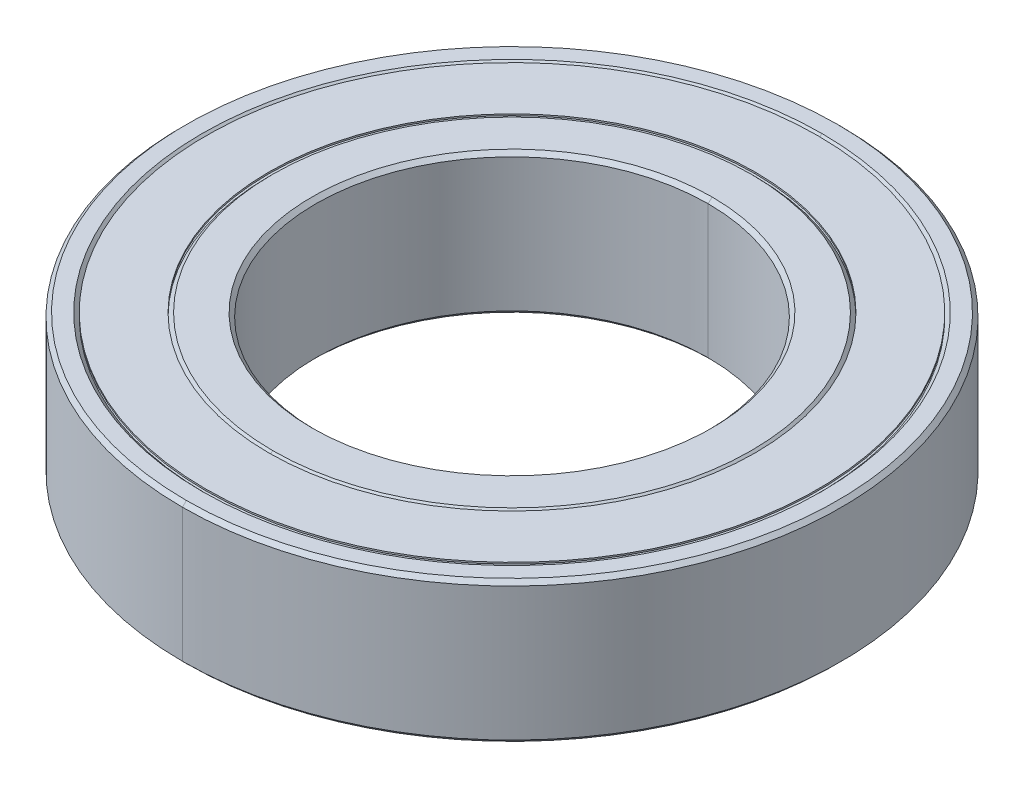
ISO-10303-21;
HEADER;
FILE_DESCRIPTION(('STEP AP214'),'2;1');
FILE_NAME('part.step','',(''),(''),'','','');
FILE_SCHEMA(('AUTOMOTIVE_DESIGN { 1 0 10303 214 1 1 1 1 }'));
ENDSEC;
DATA;
#1=APPLICATION_CONTEXT('core data for automotive mechanical design processes');
#2=APPLICATION_PROTOCOL_DEFINITION('international standard','automotive_design',2000,#1);
#3=PRODUCT_CONTEXT('',#1,'mechanical');
#4=PRODUCT('Part','Part','',(#3));
#5=PRODUCT_RELATED_PRODUCT_CATEGORY('part','',(#4));
#6=PRODUCT_DEFINITION_FORMATION('','',#4);
#7=PRODUCT_DEFINITION_CONTEXT('part definition',#1,'design');
#8=PRODUCT_DEFINITION('design','',#6,#7);
#9=PRODUCT_DEFINITION_SHAPE('','',#8);
#10=(LENGTH_UNIT() NAMED_UNIT(*) SI_UNIT(.MILLI.,.METRE.));
#11=(NAMED_UNIT(*) PLANE_ANGLE_UNIT() SI_UNIT($,.RADIAN.));
#12=(NAMED_UNIT(*) SI_UNIT($,.STERADIAN.) SOLID_ANGLE_UNIT());
#13=UNCERTAINTY_MEASURE_WITH_UNIT(LENGTH_MEASURE(1.E-05),#10,'distance_accuracy_value','');
#14=(GEOMETRIC_REPRESENTATION_CONTEXT(3) GLOBAL_UNCERTAINTY_ASSIGNED_CONTEXT((#13)) GLOBAL_UNIT_ASSIGNED_CONTEXT((#10,
#11,#12)) REPRESENTATION_CONTEXT('',''));
#15=CARTESIAN_POINT('',(0.,0.,0.));
#16=DIRECTION('',(0.,0.,1.));
#17=DIRECTION('',(1.,0.,0.));
#18=AXIS2_PLACEMENT_3D('',#15,#16,#17);
#19=CARTESIAN_POINT('',(0.,4.25,0.));
#20=DIRECTION('',(0.,1.,0.));
#21=DIRECTION('',(0.,0.,1.));
#22=AXIS2_PLACEMENT_3D('',#19,#20,#21);
#23=CONICAL_SURFACE('',#22,19.5,0.785398163397455);
#24=DIRECTION('',(0.,0.707106781186543,-0.707106781186553));
#25=VECTOR('',#24,1.);
#26=CARTESIAN_POINT('',(0.,4.25,-19.5));
#27=LINE('',#26,#25);
#28=CARTESIAN_POINT('',(0.,4.25,-19.5));
#29=VERTEX_POINT('',#28);
#30=CARTESIAN_POINT('',(0.,4.5,-19.75));
#31=VERTEX_POINT('',#30);
#32=EDGE_CURVE('P0_E179',#29,#31,#27,.T.);
#33=ORIENTED_EDGE('',*,*,#32,.F.);
#34=CARTESIAN_POINT('',(0.,4.25,0.));
#35=DIRECTION('',(0.,1.,0.));
#36=DIRECTION('',(0.,0.,1.));
#37=AXIS2_PLACEMENT_3D('',#34,#35,#36);
#38=CIRCLE('',#37,19.5);
#39=CARTESIAN_POINT('',(0.,4.25,19.5));
#40=VERTEX_POINT('',#39);
#41=EDGE_CURVE('P0_E166',#40,#29,#38,.T.);
#42=ORIENTED_EDGE('',*,*,#41,.F.);
#43=DIRECTION('',(0.,0.707106781186543,0.707106781186553));
#44=VECTOR('',#43,1.);
#45=CARTESIAN_POINT('',(0.,4.25,19.5));
#46=LINE('',#45,#44);
#47=CARTESIAN_POINT('',(0.,4.5,19.75));
#48=VERTEX_POINT('',#47);
#49=EDGE_CURVE('P0_E188',#40,#48,#46,.T.);
#50=ORIENTED_EDGE('',*,*,#49,.T.);
#51=CARTESIAN_POINT('',(0.,4.5,0.));
#52=DIRECTION('',(0.,-1.,0.));
#53=DIRECTION('',(0.,0.,1.));
#54=AXIS2_PLACEMENT_3D('',#51,#52,#53);
#55=CIRCLE('',#54,19.75);
#56=EDGE_CURVE('P0_E180',#31,#48,#55,.T.);
#57=ORIENTED_EDGE('',*,*,#56,.F.);
#58=EDGE_LOOP('',(#33,#42,#50,#57));
#59=FACE_BOUND('',#58,.T.);
#60=ADVANCED_FACE('P0_F17',(#59),#23,.F.);
#61=CARTESIAN_POINT('',(0.,4.5,0.));
#62=DIRECTION('',(0.,-1.,0.));
#63=DIRECTION('',(0.,0.,-1.));
#64=AXIS2_PLACEMENT_3D('',#61,#62,#63);
#65=CONICAL_SURFACE('',#64,20.75,0.785398163397462);
#66=DIRECTION('',(0.,-0.707106781186538,0.707106781186558));
#67=VECTOR('',#66,1.);
#68=CARTESIAN_POINT('',(0.,4.5,20.75));
#69=LINE('',#68,#67);
#70=CARTESIAN_POINT('',(0.,4.5,20.75));
#71=VERTEX_POINT('',#70);
#72=CARTESIAN_POINT('',(0.,4.25,21.));
#73=VERTEX_POINT('',#72);
#74=EDGE_CURVE('P0_E234',#71,#73,#69,.T.);
#75=ORIENTED_EDGE('',*,*,#74,.F.);
#76=CARTESIAN_POINT('',(0.,4.5,0.));
#77=DIRECTION('',(0.,1.,0.));
#78=DIRECTION('',(0.,0.,1.));
#79=AXIS2_PLACEMENT_3D('',#76,#77,#78);
#80=CIRCLE('',#79,20.75);
#81=CARTESIAN_POINT('',(0.,4.5,-20.75));
#82=VERTEX_POINT('',#81);
#83=EDGE_CURVE('P0_E289',#82,#71,#80,.T.);
#84=ORIENTED_EDGE('',*,*,#83,.F.);
#85=DIRECTION('',(0.,-0.707106781186538,-0.707106781186558));
#86=VECTOR('',#85,1.);
#87=CARTESIAN_POINT('',(0.,4.5,-20.75));
#88=LINE('',#87,#86);
#89=CARTESIAN_POINT('',(0.,4.25,-21.));
#90=VERTEX_POINT('',#89);
#91=EDGE_CURVE('P0_E205',#82,#90,#88,.T.);
#92=ORIENTED_EDGE('',*,*,#91,.T.);
#93=CARTESIAN_POINT('',(0.,4.25,0.));
#94=DIRECTION('',(0.,-1.,0.));
#95=DIRECTION('',(0.,0.,1.));
#96=AXIS2_PLACEMENT_3D('',#93,#94,#95);
#97=CIRCLE('',#96,21.);
#98=EDGE_CURVE('P0_E210',#73,#90,#97,.T.);
#99=ORIENTED_EDGE('',*,*,#98,.F.);
#100=EDGE_LOOP('',(#75,#84,#92,#99));
#101=FACE_BOUND('',#100,.T.);
#102=ADVANCED_FACE('P0_F388',(#101),#65,.T.);
#103=CARTESIAN_POINT('',(0.,4.25,0.));
#104=DIRECTION('',(0.,1.,0.));
#105=DIRECTION('',(0.,0.,1.));
#106=AXIS2_PLACEMENT_3D('',#103,#104,#105);
#107=CONICAL_SURFACE('',#106,12.5,0.785398163397459);
#108=DIRECTION('',(0.,0.70710678118654,-0.707106781186555));
#109=VECTOR('',#108,1.);
#110=CARTESIAN_POINT('',(0.,4.25,-12.5));
#111=LINE('',#110,#109);
#112=CARTESIAN_POINT('',(0.,4.25,-12.5));
#113=VERTEX_POINT('',#112);
#114=CARTESIAN_POINT('',(0.,4.5,-12.75));
#115=VERTEX_POINT('',#114);
#116=EDGE_CURVE('P0_E204',#113,#115,#111,.T.);
#117=ORIENTED_EDGE('',*,*,#116,.F.);
#118=CARTESIAN_POINT('',(0.,4.25,0.));
#119=DIRECTION('',(0.,1.,0.));
#120=DIRECTION('',(0.,0.,1.));
#121=AXIS2_PLACEMENT_3D('',#118,#119,#120);
#122=CIRCLE('',#121,12.5);
#123=CARTESIAN_POINT('',(0.,4.25,12.5));
#124=VERTEX_POINT('',#123);
#125=EDGE_CURVE('P0_E209',#124,#113,#122,.T.);
#126=ORIENTED_EDGE('',*,*,#125,.F.);
#127=DIRECTION('',(0.,0.70710678118654,0.707106781186555));
#128=VECTOR('',#127,1.);
#129=CARTESIAN_POINT('',(0.,4.25,12.5));
#130=LINE('',#129,#128);
#131=CARTESIAN_POINT('',(0.,4.5,12.75));
#132=VERTEX_POINT('',#131);
#133=EDGE_CURVE('P0_E213',#124,#132,#130,.T.);
#134=ORIENTED_EDGE('',*,*,#133,.T.);
#135=CARTESIAN_POINT('',(0.,4.5,0.));
#136=DIRECTION('',(0.,-1.,0.));
#137=DIRECTION('',(0.,0.,1.));
#138=AXIS2_PLACEMENT_3D('',#135,#136,#137);
#139=CIRCLE('',#138,12.75);
#140=EDGE_CURVE('P0_E346',#115,#132,#139,.T.);
#141=ORIENTED_EDGE('',*,*,#140,.F.);
#142=EDGE_LOOP('',(#117,#126,#134,#141));
#143=FACE_BOUND('',#142,.T.);
#144=ADVANCED_FACE('P0_F392',(#143),#107,.F.);
#145=CARTESIAN_POINT('',(0.,4.5,0.));
#146=DIRECTION('',(0.,-1.,0.));
#147=DIRECTION('',(0.,0.,-1.));
#148=AXIS2_PLACEMENT_3D('',#145,#146,#147);
#149=CONICAL_SURFACE('',#148,15.25,0.785398163397448);
#150=DIRECTION('',(0.,-0.707106781186548,0.707106781186548));
#151=VECTOR('',#150,1.);
#152=CARTESIAN_POINT('',(0.,4.5,15.25));
#153=LINE('',#152,#151);
#154=CARTESIAN_POINT('',(0.,4.5,15.25));
#155=VERTEX_POINT('',#154);
#156=CARTESIAN_POINT('',(0.,4.25,15.5));
#157=VERTEX_POINT('',#156);
#158=EDGE_CURVE('P0_E198',#155,#157,#153,.T.);
#159=ORIENTED_EDGE('',*,*,#158,.F.);
#160=CARTESIAN_POINT('',(0.,4.5,0.));
#161=DIRECTION('',(0.,1.,0.));
#162=DIRECTION('',(0.,0.,1.));
#163=AXIS2_PLACEMENT_3D('',#160,#161,#162);
#164=CIRCLE('',#163,15.25);
#165=CARTESIAN_POINT('',(0.,4.5,-15.25));
#166=VERTEX_POINT('',#165);
#167=EDGE_CURVE('P0_E343',#166,#155,#164,.T.);
#168=ORIENTED_EDGE('',*,*,#167,.F.);
#169=DIRECTION('',(0.,-0.707106781186548,-0.707106781186548));
#170=VECTOR('',#169,1.);
#171=CARTESIAN_POINT('',(0.,4.5,-15.25));
#172=LINE('',#171,#170);
#173=CARTESIAN_POINT('',(0.,4.25,-15.5));
#174=VERTEX_POINT('',#173);
#175=EDGE_CURVE('P0_E197',#166,#174,#172,.T.);
#176=ORIENTED_EDGE('',*,*,#175,.T.);
#177=CARTESIAN_POINT('',(0.,4.25,0.));
#178=DIRECTION('',(0.,1.,0.));
#179=DIRECTION('',(0.,0.,1.));
#180=AXIS2_PLACEMENT_3D('',#177,#178,#179);
#181=CIRCLE('',#180,15.5);
#182=EDGE_CURVE('P0_E175',#174,#157,#181,.T.);
#183=ORIENTED_EDGE('',*,*,#182,.T.);
#184=EDGE_LOOP('',(#159,#168,#176,#183));
#185=FACE_BOUND('',#184,.T.);
#186=ADVANCED_FACE('P0_F397',(#185),#149,.T.);
#187=CARTESIAN_POINT('',(0.,-4.5,0.));
#188=DIRECTION('',(0.,-1.,0.));
#189=DIRECTION('',(0.,0.,-1.));
#190=AXIS2_PLACEMENT_3D('',#187,#188,#189);
#191=CONICAL_SURFACE('',#190,19.75,0.785398163397462);
#192=DIRECTION('',(0.,-0.707106781186538,0.707106781186558));
#193=VECTOR('',#192,1.);
#194=CARTESIAN_POINT('',(0.,-4.5,19.75));
#195=LINE('',#194,#193);
#196=CARTESIAN_POINT('',(0.,-4.25,19.5));
#197=VERTEX_POINT('',#196);
#198=CARTESIAN_POINT('',(0.,-4.5,19.75));
#199=VERTEX_POINT('',#198);
#200=EDGE_CURVE('P0_E269',#197,#199,#195,.T.);
#201=ORIENTED_EDGE('',*,*,#200,.F.);
#202=CARTESIAN_POINT('',(0.,-4.25,0.));
#203=DIRECTION('',(0.,1.,0.));
#204=DIRECTION('',(0.,0.,1.));
#205=AXIS2_PLACEMENT_3D('',#202,#203,#204);
#206=CIRCLE('',#205,19.5);
#207=CARTESIAN_POINT('',(0.,-4.25,-19.5));
#208=VERTEX_POINT('',#207);
#209=EDGE_CURVE('P0_E25',#197,#208,#206,.T.);
#210=ORIENTED_EDGE('',*,*,#209,.T.);
#211=DIRECTION('',(0.,-0.707106781186538,-0.707106781186558));
#212=VECTOR('',#211,1.);
#213=CARTESIAN_POINT('',(0.,-4.5,-19.75));
#214=LINE('',#213,#212);
#215=CARTESIAN_POINT('',(0.,-4.5,-19.75));
#216=VERTEX_POINT('',#215);
#217=EDGE_CURVE('P0_E279',#208,#216,#214,.T.);
#218=ORIENTED_EDGE('',*,*,#217,.T.);
#219=CARTESIAN_POINT('',(0.,-4.5,0.));
#220=DIRECTION('',(0.,1.,0.));
#221=DIRECTION('',(0.,0.,1.));
#222=AXIS2_PLACEMENT_3D('',#219,#220,#221);
#223=CIRCLE('',#222,19.75);
#224=EDGE_CURVE('P0_E353',#199,#216,#223,.T.);
#225=ORIENTED_EDGE('',*,*,#224,.F.);
#226=EDGE_LOOP('',(#201,#210,#218,#225));
#227=FACE_BOUND('',#226,.T.);
#228=ADVANCED_FACE('P0_F365',(#227),#191,.F.);
#229=CARTESIAN_POINT('',(0.,-4.25,0.));
#230=DIRECTION('',(0.,1.,0.));
#231=DIRECTION('',(0.,0.,1.));
#232=AXIS2_PLACEMENT_3D('',#229,#230,#231);
#233=CONICAL_SURFACE('',#232,21.,0.785398163397455);
#234=DIRECTION('',(0.,0.707106781186543,-0.707106781186553));
#235=VECTOR('',#234,1.);
#236=CARTESIAN_POINT('',(0.,-4.25,-21.));
#237=LINE('',#236,#235);
#238=CARTESIAN_POINT('',(0.,-4.5,-20.75));
#239=VERTEX_POINT('',#238);
#240=CARTESIAN_POINT('',(0.,-4.25,-21.));
#241=VERTEX_POINT('',#240);
#242=EDGE_CURVE('P0_E225',#239,#241,#237,.T.);
#243=ORIENTED_EDGE('',*,*,#242,.F.);
#244=CARTESIAN_POINT('',(0.,-4.5,0.));
#245=DIRECTION('',(0.,-1.,0.));
#246=DIRECTION('',(0.,0.,1.));
#247=AXIS2_PLACEMENT_3D('',#244,#245,#246);
#248=CIRCLE('',#247,20.75);
#249=CARTESIAN_POINT('',(0.,-4.5,20.75));
#250=VERTEX_POINT('',#249);
#251=EDGE_CURVE('P0_E288',#250,#239,#248,.T.);
#252=ORIENTED_EDGE('',*,*,#251,.F.);
#253=DIRECTION('',(0.,0.707106781186543,0.707106781186553));
#254=VECTOR('',#253,1.);
#255=CARTESIAN_POINT('',(0.,-4.25,21.));
#256=LINE('',#255,#254);
#257=CARTESIAN_POINT('',(0.,-4.25,21.));
#258=VERTEX_POINT('',#257);
#259=EDGE_CURVE('P0_E293',#250,#258,#256,.T.);
#260=ORIENTED_EDGE('',*,*,#259,.T.);
#261=CARTESIAN_POINT('',(0.,-4.25,0.));
#262=DIRECTION('',(0.,1.,0.));
#263=DIRECTION('',(0.,0.,1.));
#264=AXIS2_PLACEMENT_3D('',#261,#262,#263);
#265=CIRCLE('',#264,21.);
#266=EDGE_CURVE('P0_E206',#241,#258,#265,.T.);
#267=ORIENTED_EDGE('',*,*,#266,.F.);
#268=EDGE_LOOP('',(#243,#252,#260,#267));
#269=FACE_BOUND('',#268,.T.);
#270=ADVANCED_FACE('P0_F404',(#269),#233,.T.);
#271=CARTESIAN_POINT('',(0.,-4.5,0.));
#272=DIRECTION('',(0.,-1.,0.));
#273=DIRECTION('',(0.,0.,-1.));
#274=AXIS2_PLACEMENT_3D('',#271,#272,#273);
#275=CONICAL_SURFACE('',#274,12.75,0.785398163397438);
#276=DIRECTION('',(0.,-0.707106781186555,0.70710678118654));
#277=VECTOR('',#276,1.);
#278=CARTESIAN_POINT('',(0.,-4.5,12.75));
#279=LINE('',#278,#277);
#280=CARTESIAN_POINT('',(0.,-4.25,12.5));
#281=VERTEX_POINT('',#280);
#282=CARTESIAN_POINT('',(0.,-4.5,12.75));
#283=VERTEX_POINT('',#282);
#284=EDGE_CURVE('P0_E301',#281,#283,#279,.T.);
#285=ORIENTED_EDGE('',*,*,#284,.F.);
#286=CARTESIAN_POINT('',(0.,-4.25,0.));
#287=DIRECTION('',(0.,-1.,0.));
#288=DIRECTION('',(0.,0.,1.));
#289=AXIS2_PLACEMENT_3D('',#286,#287,#288);
#290=CIRCLE('',#289,12.5);
#291=CARTESIAN_POINT('',(0.,-4.25,-12.5));
#292=VERTEX_POINT('',#291);
#293=EDGE_CURVE('P0_E176',#292,#281,#290,.T.);
#294=ORIENTED_EDGE('',*,*,#293,.F.);
#295=DIRECTION('',(0.,-0.707106781186555,-0.70710678118654));
#296=VECTOR('',#295,1.);
#297=CARTESIAN_POINT('',(0.,-4.5,-12.75));
#298=LINE('',#297,#296);
#299=CARTESIAN_POINT('',(0.,-4.5,-12.75));
#300=VERTEX_POINT('',#299);
#301=EDGE_CURVE('P0_E309',#292,#300,#298,.T.);
#302=ORIENTED_EDGE('',*,*,#301,.T.);
#303=CARTESIAN_POINT('',(0.,-4.5,0.));
#304=DIRECTION('',(0.,1.,0.));
#305=DIRECTION('',(0.,0.,1.));
#306=AXIS2_PLACEMENT_3D('',#303,#304,#305);
#307=CIRCLE('',#306,12.75);
#308=EDGE_CURVE('P0_E340',#283,#300,#307,.T.);
#309=ORIENTED_EDGE('',*,*,#308,.F.);
#310=EDGE_LOOP('',(#285,#294,#302,#309));
#311=FACE_BOUND('',#310,.T.);
#312=ADVANCED_FACE('P0_F383',(#311),#275,.F.);
#313=CARTESIAN_POINT('',(0.,-4.25,0.));
#314=DIRECTION('',(0.,1.,0.));
#315=DIRECTION('',(0.,0.,1.));
#316=AXIS2_PLACEMENT_3D('',#313,#314,#315);
#317=CONICAL_SURFACE('',#316,15.5,0.785398163397452);
#318=DIRECTION('',(0.,0.707106781186545,-0.70710678118655));
#319=VECTOR('',#318,1.);
#320=CARTESIAN_POINT('',(0.,-4.25,-15.5));
#321=LINE('',#320,#319);
#322=CARTESIAN_POINT('',(0.,-4.5,-15.25));
#323=VERTEX_POINT('',#322);
#324=CARTESIAN_POINT('',(0.,-4.25,-15.5));
#325=VERTEX_POINT('',#324);
#326=EDGE_CURVE('P0_E256',#323,#325,#321,.T.);
#327=ORIENTED_EDGE('',*,*,#326,.F.);
#328=CARTESIAN_POINT('',(0.,-4.5,0.));
#329=DIRECTION('',(0.,-1.,0.));
#330=DIRECTION('',(0.,0.,1.));
#331=AXIS2_PLACEMENT_3D('',#328,#329,#330);
#332=CIRCLE('',#331,15.25);
#333=CARTESIAN_POINT('',(0.,-4.5,15.25));
#334=VERTEX_POINT('',#333);
#335=EDGE_CURVE('P0_E337',#334,#323,#332,.T.);
#336=ORIENTED_EDGE('',*,*,#335,.F.);
#337=DIRECTION('',(0.,0.707106781186545,0.70710678118655));
#338=VECTOR('',#337,1.);
#339=CARTESIAN_POINT('',(0.,-4.25,15.5));
#340=LINE('',#339,#338);
#341=CARTESIAN_POINT('',(0.,-4.25,15.5));
#342=VERTEX_POINT('',#341);
#343=EDGE_CURVE('P0_E318',#334,#342,#340,.T.);
#344=ORIENTED_EDGE('',*,*,#343,.T.);
#345=CARTESIAN_POINT('',(0.,-4.25,0.));
#346=DIRECTION('',(0.,1.,0.));
#347=DIRECTION('',(0.,0.,1.));
#348=AXIS2_PLACEMENT_3D('',#345,#346,#347);
#349=CIRCLE('',#348,15.5);
#350=EDGE_CURVE('P0_E11',#325,#342,#349,.T.);
#351=ORIENTED_EDGE('',*,*,#350,.F.);
#352=EDGE_LOOP('',(#327,#336,#344,#351));
#353=FACE_BOUND('',#352,.T.);
#354=ADVANCED_FACE('P0_F373',(#353),#317,.T.);
#355=CARTESIAN_POINT('',(0.,-4.25,0.));
#356=DIRECTION('',(0.,-1.,0.));
#357=DIRECTION('',(0.,0.,-1.));
#358=AXIS2_PLACEMENT_3D('',#355,#356,#357);
#359=PLANE('',#358);
#360=CARTESIAN_POINT('',(0.,-4.25,0.));
#361=DIRECTION('',(0.,1.,0.));
#362=DIRECTION('',(0.,0.,1.));
#363=AXIS2_PLACEMENT_3D('',#360,#361,#362);
#364=CIRCLE('',#363,15.5);
#365=EDGE_CURVE('P0_E260',#342,#325,#364,.T.);
#366=ORIENTED_EDGE('',*,*,#365,.T.);
#367=ORIENTED_EDGE('',*,*,#350,.T.);
#368=EDGE_LOOP('',(#366,#367));
#369=FACE_BOUND('',#368,.T.);
#370=CARTESIAN_POINT('',(0.,-4.25,0.));
#371=DIRECTION('',(0.,1.,0.));
#372=DIRECTION('',(0.,0.,1.));
#373=AXIS2_PLACEMENT_3D('',#370,#371,#372);
#374=CIRCLE('',#373,19.5);
#375=EDGE_CURVE('P0_E265',#208,#197,#374,.T.);
#376=ORIENTED_EDGE('',*,*,#375,.F.);
#377=ORIENTED_EDGE('',*,*,#209,.F.);
#378=EDGE_LOOP('',(#376,#377));
#379=FACE_BOUND('',#378,.T.);
#380=ADVANCED_FACE('P0_F371',(#369,#379),#359,.T.);
#381=CARTESIAN_POINT('',(0.,4.25,0.));
#382=DIRECTION('',(0.,1.,0.));
#383=DIRECTION('',(1.,0.,0.));
#384=AXIS2_PLACEMENT_3D('',#381,#382,#383);
#385=PLANE('',#384);
#386=ORIENTED_EDGE('',*,*,#182,.F.);
#387=CARTESIAN_POINT('',(0.,4.25,0.));
#388=DIRECTION('',(0.,1.,0.));
#389=DIRECTION('',(0.,0.,1.));
#390=AXIS2_PLACEMENT_3D('',#387,#388,#389);
#391=CIRCLE('',#390,15.5);
#392=EDGE_CURVE('P0_E195',#157,#174,#391,.T.);
#393=ORIENTED_EDGE('',*,*,#392,.F.);
#394=EDGE_LOOP('',(#386,#393));
#395=FACE_BOUND('',#394,.T.);
#396=ORIENTED_EDGE('',*,*,#41,.T.);
#397=CARTESIAN_POINT('',(0.,4.25,0.));
#398=DIRECTION('',(0.,1.,0.));
#399=DIRECTION('',(0.,0.,1.));
#400=AXIS2_PLACEMENT_3D('',#397,#398,#399);
#401=CIRCLE('',#400,19.5);
#402=EDGE_CURVE('P0_E170',#29,#40,#401,.T.);
#403=ORIENTED_EDGE('',*,*,#402,.T.);
#404=EDGE_LOOP('',(#396,#403));
#405=FACE_BOUND('',#404,.T.);
#406=ADVANCED_FACE('P0_F168',(#395,#405),#385,.T.);
#407=CARTESIAN_POINT('',(0.,4.5,0.));
#408=DIRECTION('',(0.,-1.,0.));
#409=DIRECTION('',(0.,0.,-1.));
#410=AXIS2_PLACEMENT_3D('',#407,#408,#409);
#411=CYLINDRICAL_SURFACE('',#410,12.5);
#412=DIRECTION('',(0.,-1.,0.));
#413=VECTOR('',#412,1.);
#414=CARTESIAN_POINT('',(0.,4.5,12.5));
#415=LINE('',#414,#413);
#416=EDGE_CURVE('P0_E321',#124,#281,#415,.T.);
#417=ORIENTED_EDGE('',*,*,#416,.F.);
#418=ORIENTED_EDGE('',*,*,#125,.T.);
#419=DIRECTION('',(0.,-1.,0.));
#420=VECTOR('',#419,1.);
#421=CARTESIAN_POINT('',(0.,4.5,-12.5));
#422=LINE('',#421,#420);
#423=EDGE_CURVE('P0_E325',#113,#292,#422,.T.);
#424=ORIENTED_EDGE('',*,*,#423,.T.);
#425=ORIENTED_EDGE('',*,*,#293,.T.);
#426=EDGE_LOOP('',(#417,#418,#424,#425));
#427=FACE_BOUND('',#426,.T.);
#428=ADVANCED_FACE('P0_F380',(#427),#411,.F.);
#429=CARTESIAN_POINT('',(0.,4.5,0.));
#430=DIRECTION('',(0.,-1.,0.));
#431=DIRECTION('',(0.,0.,-1.));
#432=AXIS2_PLACEMENT_3D('',#429,#430,#431);
#433=CYLINDRICAL_SURFACE('',#432,21.);
#434=DIRECTION('',(0.,-1.,0.));
#435=VECTOR('',#434,1.);
#436=CARTESIAN_POINT('',(0.,4.5,21.));
#437=LINE('',#436,#435);
#438=EDGE_CURVE('P0_E329',#73,#258,#437,.T.);
#439=ORIENTED_EDGE('',*,*,#438,.F.);
#440=ORIENTED_EDGE('',*,*,#98,.T.);
#441=DIRECTION('',(0.,-1.,0.));
#442=VECTOR('',#441,1.);
#443=CARTESIAN_POINT('',(0.,4.5,-21.));
#444=LINE('',#443,#442);
#445=EDGE_CURVE('P0_E333',#90,#241,#444,.T.);
#446=ORIENTED_EDGE('',*,*,#445,.T.);
#447=ORIENTED_EDGE('',*,*,#266,.T.);
#448=EDGE_LOOP('',(#439,#440,#446,#447));
#449=FACE_BOUND('',#448,.T.);
#450=ADVANCED_FACE('P0_F413',(#449),#433,.T.);
#451=CARTESIAN_POINT('',(0.,-4.5,0.));
#452=DIRECTION('',(0.,1.,0.));
#453=DIRECTION('',(1.,0.,0.));
#454=AXIS2_PLACEMENT_3D('',#451,#452,#453);
#455=PLANE('',#454);
#456=CARTESIAN_POINT('',(0.,-4.5,0.));
#457=DIRECTION('',(0.,1.,0.));
#458=DIRECTION('',(0.,0.,1.));
#459=AXIS2_PLACEMENT_3D('',#456,#457,#458);
#460=CIRCLE('',#459,19.75);
#461=EDGE_CURVE('P0_E273',#216,#199,#460,.T.);
#462=ORIENTED_EDGE('',*,*,#461,.T.);
#463=ORIENTED_EDGE('',*,*,#224,.T.);
#464=EDGE_LOOP('',(#462,#463));
#465=FACE_BOUND('',#464,.T.);
#466=ORIENTED_EDGE('',*,*,#251,.T.);
#467=CARTESIAN_POINT('',(0.,-4.5,0.));
#468=DIRECTION('',(0.,-1.,0.));
#469=DIRECTION('',(0.,0.,1.));
#470=AXIS2_PLACEMENT_3D('',#467,#468,#469);
#471=CIRCLE('',#470,20.75);
#472=EDGE_CURVE('P0_E230',#239,#250,#471,.T.);
#473=ORIENTED_EDGE('',*,*,#472,.T.);
#474=EDGE_LOOP('',(#466,#473));
#475=FACE_BOUND('',#474,.T.);
#476=ADVANCED_FACE('P0_F417',(#465,#475),#455,.F.);
#477=CARTESIAN_POINT('',(0.,4.5,0.));
#478=DIRECTION('',(0.,1.,0.));
#479=DIRECTION('',(1.,0.,0.));
#480=AXIS2_PLACEMENT_3D('',#477,#478,#479);
#481=PLANE('',#480);
#482=CARTESIAN_POINT('',(0.,4.5,0.));
#483=DIRECTION('',(0.,-1.,0.));
#484=DIRECTION('',(0.,0.,1.));
#485=AXIS2_PLACEMENT_3D('',#482,#483,#484);
#486=CIRCLE('',#485,19.75);
#487=EDGE_CURVE('P0_E185',#48,#31,#486,.T.);
#488=ORIENTED_EDGE('',*,*,#487,.T.);
#489=ORIENTED_EDGE('',*,*,#56,.T.);
#490=EDGE_LOOP('',(#488,#489));
#491=FACE_BOUND('',#490,.T.);
#492=ORIENTED_EDGE('',*,*,#83,.T.);
#493=CARTESIAN_POINT('',(0.,4.5,0.));
#494=DIRECTION('',(0.,1.,0.));
#495=DIRECTION('',(0.,0.,1.));
#496=AXIS2_PLACEMENT_3D('',#493,#494,#495);
#497=CIRCLE('',#496,20.75);
#498=EDGE_CURVE('P0_E221',#71,#82,#497,.T.);
#499=ORIENTED_EDGE('',*,*,#498,.T.);
#500=EDGE_LOOP('',(#492,#499));
#501=FACE_BOUND('',#500,.T.);
#502=ADVANCED_FACE('P0_F419',(#491,#501),#481,.T.);
#503=CARTESIAN_POINT('',(0.,4.5,0.));
#504=DIRECTION('',(0.,1.,0.));
#505=DIRECTION('',(1.,0.,0.));
#506=AXIS2_PLACEMENT_3D('',#503,#504,#505);
#507=PLANE('',#506);
#508=CARTESIAN_POINT('',(0.,4.5,0.));
#509=DIRECTION('',(0.,-1.,0.));
#510=DIRECTION('',(0.,0.,1.));
#511=AXIS2_PLACEMENT_3D('',#508,#509,#510);
#512=CIRCLE('',#511,12.75);
#513=EDGE_CURVE('P0_E218',#132,#115,#512,.T.);
#514=ORIENTED_EDGE('',*,*,#513,.T.);
#515=ORIENTED_EDGE('',*,*,#140,.T.);
#516=EDGE_LOOP('',(#514,#515));
#517=FACE_BOUND('',#516,.T.);
#518=ORIENTED_EDGE('',*,*,#167,.T.);
#519=CARTESIAN_POINT('',(0.,4.5,0.));
#520=DIRECTION('',(0.,1.,0.));
#521=DIRECTION('',(0.,0.,1.));
#522=AXIS2_PLACEMENT_3D('',#519,#520,#521);
#523=CIRCLE('',#522,15.25);
#524=EDGE_CURVE('P0_E217',#155,#166,#523,.T.);
#525=ORIENTED_EDGE('',*,*,#524,.T.);
#526=EDGE_LOOP('',(#518,#525));
#527=FACE_BOUND('',#526,.T.);
#528=ADVANCED_FACE('P0_F422',(#517,#527),#507,.T.);
#529=CARTESIAN_POINT('',(0.,-4.5,0.));
#530=DIRECTION('',(0.,1.,0.));
#531=DIRECTION('',(1.,0.,0.));
#532=AXIS2_PLACEMENT_3D('',#529,#530,#531);
#533=PLANE('',#532);
#534=CARTESIAN_POINT('',(0.,-4.5,0.));
#535=DIRECTION('',(0.,1.,0.));
#536=DIRECTION('',(0.,0.,1.));
#537=AXIS2_PLACEMENT_3D('',#534,#535,#536);
#538=CIRCLE('',#537,12.75);
#539=EDGE_CURVE('P0_E305',#300,#283,#538,.T.);
#540=ORIENTED_EDGE('',*,*,#539,.T.);
#541=ORIENTED_EDGE('',*,*,#308,.T.);
#542=EDGE_LOOP('',(#540,#541));
#543=FACE_BOUND('',#542,.T.);
#544=ORIENTED_EDGE('',*,*,#335,.T.);
#545=CARTESIAN_POINT('',(0.,-4.5,0.));
#546=DIRECTION('',(0.,-1.,0.));
#547=DIRECTION('',(0.,0.,1.));
#548=AXIS2_PLACEMENT_3D('',#545,#546,#547);
#549=CIRCLE('',#548,15.25);
#550=EDGE_CURVE('P0_E261',#323,#334,#549,.T.);
#551=ORIENTED_EDGE('',*,*,#550,.T.);
#552=EDGE_LOOP('',(#544,#551));
#553=FACE_BOUND('',#552,.T.);
#554=ADVANCED_FACE('P0_F426',(#543,#553),#533,.F.);
#555=CARTESIAN_POINT('',(0.,4.5,0.));
#556=DIRECTION('',(0.,-1.,0.));
#557=DIRECTION('',(0.,0.,-1.));
#558=AXIS2_PLACEMENT_3D('',#555,#556,#557);
#559=CYLINDRICAL_SURFACE('',#558,21.);
#560=CARTESIAN_POINT('',(0.,4.25,0.));
#561=DIRECTION('',(0.,-1.,0.));
#562=DIRECTION('',(0.,0.,1.));
#563=AXIS2_PLACEMENT_3D('',#560,#561,#562);
#564=CIRCLE('',#563,21.);
#565=EDGE_CURVE('P0_E238',#90,#73,#564,.T.);
#566=ORIENTED_EDGE('',*,*,#565,.T.);
#567=ORIENTED_EDGE('',*,*,#438,.T.);
#568=CARTESIAN_POINT('',(0.,-4.25,0.));
#569=DIRECTION('',(0.,1.,0.));
#570=DIRECTION('',(0.,0.,1.));
#571=AXIS2_PLACEMENT_3D('',#568,#569,#570);
#572=CIRCLE('',#571,21.);
#573=EDGE_CURVE('P0_E229',#258,#241,#572,.T.);
#574=ORIENTED_EDGE('',*,*,#573,.T.);
#575=ORIENTED_EDGE('',*,*,#445,.F.);
#576=EDGE_LOOP('',(#566,#567,#574,#575));
#577=FACE_BOUND('',#576,.T.);
#578=ADVANCED_FACE('P0_F429',(#577),#559,.T.);
#579=CARTESIAN_POINT('',(0.,4.5,0.));
#580=DIRECTION('',(0.,-1.,0.));
#581=DIRECTION('',(0.,0.,-1.));
#582=AXIS2_PLACEMENT_3D('',#579,#580,#581);
#583=CYLINDRICAL_SURFACE('',#582,12.5);
#584=CARTESIAN_POINT('',(0.,4.25,0.));
#585=DIRECTION('',(0.,1.,0.));
#586=DIRECTION('',(0.,0.,1.));
#587=AXIS2_PLACEMENT_3D('',#584,#585,#586);
#588=CIRCLE('',#587,12.5);
#589=EDGE_CURVE('P0_E200',#113,#124,#588,.T.);
#590=ORIENTED_EDGE('',*,*,#589,.T.);
#591=ORIENTED_EDGE('',*,*,#416,.T.);
#592=CARTESIAN_POINT('',(0.,-4.25,0.));
#593=DIRECTION('',(0.,-1.,0.));
#594=DIRECTION('',(0.,0.,1.));
#595=AXIS2_PLACEMENT_3D('',#592,#593,#594);
#596=CIRCLE('',#595,12.5);
#597=EDGE_CURVE('P0_E297',#281,#292,#596,.T.);
#598=ORIENTED_EDGE('',*,*,#597,.T.);
#599=ORIENTED_EDGE('',*,*,#423,.F.);
#600=EDGE_LOOP('',(#590,#591,#598,#599));
#601=FACE_BOUND('',#600,.T.);
#602=ADVANCED_FACE('P0_F431',(#601),#583,.F.);
#603=CARTESIAN_POINT('',(0.,-4.25,0.));
#604=DIRECTION('',(0.,1.,0.));
#605=DIRECTION('',(0.,0.,1.));
#606=AXIS2_PLACEMENT_3D('',#603,#604,#605);
#607=CONICAL_SURFACE('',#606,15.5,0.785398163397452);
#608=ORIENTED_EDGE('',*,*,#550,.F.);
#609=ORIENTED_EDGE('',*,*,#326,.T.);
#610=ORIENTED_EDGE('',*,*,#365,.F.);
#611=ORIENTED_EDGE('',*,*,#343,.F.);
#612=EDGE_LOOP('',(#608,#609,#610,#611));
#613=FACE_BOUND('',#612,.T.);
#614=ADVANCED_FACE('P0_F433',(#613),#607,.T.);
#615=CARTESIAN_POINT('',(0.,-4.5,0.));
#616=DIRECTION('',(0.,-1.,0.));
#617=DIRECTION('',(0.,0.,-1.));
#618=AXIS2_PLACEMENT_3D('',#615,#616,#617);
#619=CONICAL_SURFACE('',#618,12.75,0.785398163397438);
#620=ORIENTED_EDGE('',*,*,#597,.F.);
#621=ORIENTED_EDGE('',*,*,#284,.T.);
#622=ORIENTED_EDGE('',*,*,#539,.F.);
#623=ORIENTED_EDGE('',*,*,#301,.F.);
#624=EDGE_LOOP('',(#620,#621,#622,#623));
#625=FACE_BOUND('',#624,.T.);
#626=ADVANCED_FACE('P0_F439',(#625),#619,.F.);
#627=CARTESIAN_POINT('',(0.,-4.25,0.));
#628=DIRECTION('',(0.,1.,0.));
#629=DIRECTION('',(0.,0.,1.));
#630=AXIS2_PLACEMENT_3D('',#627,#628,#629);
#631=CONICAL_SURFACE('',#630,21.,0.785398163397455);
#632=ORIENTED_EDGE('',*,*,#472,.F.);
#633=ORIENTED_EDGE('',*,*,#242,.T.);
#634=ORIENTED_EDGE('',*,*,#573,.F.);
#635=ORIENTED_EDGE('',*,*,#259,.F.);
#636=EDGE_LOOP('',(#632,#633,#634,#635));
#637=FACE_BOUND('',#636,.T.);
#638=ADVANCED_FACE('P0_F462',(#637),#631,.T.);
#639=CARTESIAN_POINT('',(0.,-4.5,0.));
#640=DIRECTION('',(0.,-1.,0.));
#641=DIRECTION('',(0.,0.,-1.));
#642=AXIS2_PLACEMENT_3D('',#639,#640,#641);
#643=CONICAL_SURFACE('',#642,19.75,0.785398163397462);
#644=ORIENTED_EDGE('',*,*,#375,.T.);
#645=ORIENTED_EDGE('',*,*,#200,.T.);
#646=ORIENTED_EDGE('',*,*,#461,.F.);
#647=ORIENTED_EDGE('',*,*,#217,.F.);
#648=EDGE_LOOP('',(#644,#645,#646,#647));
#649=FACE_BOUND('',#648,.T.);
#650=ADVANCED_FACE('P0_F370',(#649),#643,.F.);
#651=CARTESIAN_POINT('',(0.,4.5,0.));
#652=DIRECTION('',(0.,-1.,0.));
#653=DIRECTION('',(0.,0.,-1.));
#654=AXIS2_PLACEMENT_3D('',#651,#652,#653);
#655=CONICAL_SURFACE('',#654,15.25,0.785398163397448);
#656=ORIENTED_EDGE('',*,*,#524,.F.);
#657=ORIENTED_EDGE('',*,*,#158,.T.);
#658=ORIENTED_EDGE('',*,*,#392,.T.);
#659=ORIENTED_EDGE('',*,*,#175,.F.);
#660=EDGE_LOOP('',(#656,#657,#658,#659));
#661=FACE_BOUND('',#660,.T.);
#662=ADVANCED_FACE('P0_F471',(#661),#655,.T.);
#663=CARTESIAN_POINT('',(0.,4.25,0.));
#664=DIRECTION('',(0.,1.,0.));
#665=DIRECTION('',(0.,0.,1.));
#666=AXIS2_PLACEMENT_3D('',#663,#664,#665);
#667=CONICAL_SURFACE('',#666,12.5,0.785398163397459);
#668=ORIENTED_EDGE('',*,*,#589,.F.);
#669=ORIENTED_EDGE('',*,*,#116,.T.);
#670=ORIENTED_EDGE('',*,*,#513,.F.);
#671=ORIENTED_EDGE('',*,*,#133,.F.);
#672=EDGE_LOOP('',(#668,#669,#670,#671));
#673=FACE_BOUND('',#672,.T.);
#674=ADVANCED_FACE('P0_F451',(#673),#667,.F.);
#675=CARTESIAN_POINT('',(0.,4.5,0.));
#676=DIRECTION('',(0.,-1.,0.));
#677=DIRECTION('',(0.,0.,-1.));
#678=AXIS2_PLACEMENT_3D('',#675,#676,#677);
#679=CONICAL_SURFACE('',#678,20.75,0.785398163397462);
#680=ORIENTED_EDGE('',*,*,#498,.F.);
#681=ORIENTED_EDGE('',*,*,#74,.T.);
#682=ORIENTED_EDGE('',*,*,#565,.F.);
#683=ORIENTED_EDGE('',*,*,#91,.F.);
#684=EDGE_LOOP('',(#680,#681,#682,#683));
#685=FACE_BOUND('',#684,.T.);
#686=ADVANCED_FACE('P0_F480',(#685),#679,.T.);
#687=CARTESIAN_POINT('',(0.,4.25,0.));
#688=DIRECTION('',(0.,1.,0.));
#689=DIRECTION('',(0.,0.,1.));
#690=AXIS2_PLACEMENT_3D('',#687,#688,#689);
#691=CONICAL_SURFACE('',#690,19.5,0.785398163397455);
#692=ORIENTED_EDGE('',*,*,#402,.F.);
#693=ORIENTED_EDGE('',*,*,#32,.T.);
#694=ORIENTED_EDGE('',*,*,#487,.F.);
#695=ORIENTED_EDGE('',*,*,#49,.F.);
#696=EDGE_LOOP('',(#692,#693,#694,#695));
#697=FACE_BOUND('',#696,.T.);
#698=ADVANCED_FACE('P0_F187',(#697),#691,.F.);
#699=CLOSED_SHELL('',(#60,#102,#144,#186,#228,#270,#312,#354,#380,#406,#428,#450,#476,#502,#528,
#554,#578,#602,#614,#626,#638,#650,#662,#674,#686,#698));
#700=MANIFOLD_SOLID_BREP('P0_B1',#699);
#701=CARTESIAN_POINT('',(0.,-4.4,0.));
#702=DIRECTION('',(0.,-1.,0.));
#703=DIRECTION('',(0.,0.,-1.));
#704=AXIS2_PLACEMENT_3D('',#701,#702,#703);
#705=PLANE('',#704);
#706=CARTESIAN_POINT('',(0.,-4.4,0.));
#707=DIRECTION('',(0.,1.,0.));
#708=DIRECTION('',(0.,0.,1.));
#709=AXIS2_PLACEMENT_3D('',#706,#707,#708);
#710=CIRCLE('',#709,15.5);
#711=CARTESIAN_POINT('',(0.,-4.4,-15.5));
#712=VERTEX_POINT('',#711);
#713=CARTESIAN_POINT('',(0.,-4.4,15.5));
#714=VERTEX_POINT('',#713);
#715=EDGE_CURVE('P1_E117',#712,#714,#710,.T.);
#716=ORIENTED_EDGE('',*,*,#715,.F.);
#717=CARTESIAN_POINT('',(0.,-4.4,0.));
#718=DIRECTION('',(0.,1.,0.));
#719=DIRECTION('',(0.,0.,1.));
#720=AXIS2_PLACEMENT_3D('',#717,#718,#719);
#721=CIRCLE('',#720,15.5);
#722=EDGE_CURVE('P1_E27',#714,#712,#721,.T.);
#723=ORIENTED_EDGE('',*,*,#722,.F.);
#724=EDGE_LOOP('',(#716,#723));
#725=FACE_BOUND('',#724,.T.);
#726=CARTESIAN_POINT('',(0.,-4.4,0.));
#727=DIRECTION('',(0.,1.,0.));
#728=DIRECTION('',(0.,0.,1.));
#729=AXIS2_PLACEMENT_3D('',#726,#727,#728);
#730=CIRCLE('',#729,19.5);
#731=CARTESIAN_POINT('',(0.,-4.4,-19.5));
#732=VERTEX_POINT('',#731);
#733=CARTESIAN_POINT('',(0.,-4.4,19.5));
#734=VERTEX_POINT('',#733);
#735=EDGE_CURVE('P1_E73',#732,#734,#730,.T.);
#736=ORIENTED_EDGE('',*,*,#735,.T.);
#737=CARTESIAN_POINT('',(0.,-4.4,0.));
#738=DIRECTION('',(0.,1.,0.));
#739=DIRECTION('',(0.,0.,1.));
#740=AXIS2_PLACEMENT_3D('',#737,#738,#739);
#741=CIRCLE('',#740,19.5);
#742=EDGE_CURVE('P1_E75',#734,#732,#741,.T.);
#743=ORIENTED_EDGE('',*,*,#742,.T.);
#744=EDGE_LOOP('',(#736,#743));
#745=FACE_BOUND('',#744,.T.);
#746=ADVANCED_FACE('P1_F18',(#725,#745),#705,.F.);
#747=CARTESIAN_POINT('',(0.,-4.5,0.));
#748=DIRECTION('',(0.,-1.,0.));
#749=DIRECTION('',(0.,0.,-1.));
#750=AXIS2_PLACEMENT_3D('',#747,#748,#749);
#751=PLANE('',#750);
#752=CARTESIAN_POINT('',(0.,-4.5,0.));
#753=DIRECTION('',(0.,1.,0.));
#754=DIRECTION('',(0.,0.,1.));
#755=AXIS2_PLACEMENT_3D('',#752,#753,#754);
#756=CIRCLE('',#755,15.5);
#757=CARTESIAN_POINT('',(0.,-4.5,-15.5));
#758=VERTEX_POINT('',#757);
#759=CARTESIAN_POINT('',(0.,-4.5,15.5));
#760=VERTEX_POINT('',#759);
#761=EDGE_CURVE('P1_E97',#758,#760,#756,.T.);
#762=ORIENTED_EDGE('',*,*,#761,.T.);
#763=CARTESIAN_POINT('',(0.,-4.5,0.));
#764=DIRECTION('',(0.,1.,0.));
#765=DIRECTION('',(0.,0.,1.));
#766=AXIS2_PLACEMENT_3D('',#763,#764,#765);
#767=CIRCLE('',#766,15.5);
#768=EDGE_CURVE('P1_E11',#760,#758,#767,.T.);
#769=ORIENTED_EDGE('',*,*,#768,.T.);
#770=EDGE_LOOP('',(#762,#769));
#771=FACE_BOUND('',#770,.T.);
#772=CARTESIAN_POINT('',(0.,-4.5,0.));
#773=DIRECTION('',(0.,1.,0.));
#774=DIRECTION('',(0.,0.,1.));
#775=AXIS2_PLACEMENT_3D('',#772,#773,#774);
#776=CIRCLE('',#775,19.5);
#777=CARTESIAN_POINT('',(0.,-4.5,-19.5));
#778=VERTEX_POINT('',#777);
#779=CARTESIAN_POINT('',(0.,-4.5,19.5));
#780=VERTEX_POINT('',#779);
#781=EDGE_CURVE('P1_E39',#778,#780,#776,.T.);
#782=ORIENTED_EDGE('',*,*,#781,.F.);
#783=CARTESIAN_POINT('',(0.,-4.5,0.));
#784=DIRECTION('',(0.,1.,0.));
#785=DIRECTION('',(0.,0.,1.));
#786=AXIS2_PLACEMENT_3D('',#783,#784,#785);
#787=CIRCLE('',#786,19.5);
#788=EDGE_CURVE('P1_E86',#780,#778,#787,.T.);
#789=ORIENTED_EDGE('',*,*,#788,.F.);
#790=EDGE_LOOP('',(#782,#789));
#791=FACE_BOUND('',#790,.T.);
#792=ADVANCED_FACE('P1_F20',(#771,#791),#751,.T.);
#793=CARTESIAN_POINT('',(0.,-4.5,0.));
#794=DIRECTION('',(0.,-1.,0.));
#795=DIRECTION('',(0.,0.,-1.));
#796=AXIS2_PLACEMENT_3D('',#793,#794,#795);
#797=CYLINDRICAL_SURFACE('',#796,15.5);
#798=DIRECTION('',(0.,-1.,0.));
#799=VECTOR('',#798,1.);
#800=CARTESIAN_POINT('',(0.,-4.5,15.5));
#801=LINE('',#800,#799);
#802=EDGE_CURVE('P1_E111',#714,#760,#801,.T.);
#803=ORIENTED_EDGE('',*,*,#802,.F.);
#804=ORIENTED_EDGE('',*,*,#722,.T.);
#805=DIRECTION('',(0.,-1.,0.));
#806=VECTOR('',#805,1.);
#807=CARTESIAN_POINT('',(0.,-4.5,-15.5));
#808=LINE('',#807,#806);
#809=EDGE_CURVE('P1_E90',#712,#758,#808,.T.);
#810=ORIENTED_EDGE('',*,*,#809,.T.);
#811=ORIENTED_EDGE('',*,*,#768,.F.);
#812=EDGE_LOOP('',(#803,#804,#810,#811));
#813=FACE_BOUND('',#812,.T.);
#814=ADVANCED_FACE('P1_F108',(#813),#797,.F.);
#815=CARTESIAN_POINT('',(0.,-4.5,0.));
#816=DIRECTION('',(0.,-1.,0.));
#817=DIRECTION('',(0.,0.,-1.));
#818=AXIS2_PLACEMENT_3D('',#815,#816,#817);
#819=CYLINDRICAL_SURFACE('',#818,19.5);
#820=DIRECTION('',(0.,-1.,0.));
#821=VECTOR('',#820,1.);
#822=CARTESIAN_POINT('',(0.,-4.5,19.5));
#823=LINE('',#822,#821);
#824=EDGE_CURVE('P1_E81',#734,#780,#823,.T.);
#825=ORIENTED_EDGE('',*,*,#824,.F.);
#826=ORIENTED_EDGE('',*,*,#735,.F.);
#827=DIRECTION('',(0.,-1.,0.));
#828=VECTOR('',#827,1.);
#829=CARTESIAN_POINT('',(0.,-4.5,-19.5));
#830=LINE('',#829,#828);
#831=EDGE_CURVE('P1_E78',#732,#778,#830,.T.);
#832=ORIENTED_EDGE('',*,*,#831,.T.);
#833=ORIENTED_EDGE('',*,*,#781,.T.);
#834=EDGE_LOOP('',(#825,#826,#832,#833));
#835=FACE_BOUND('',#834,.T.);
#836=ADVANCED_FACE('P1_F82',(#835),#819,.T.);
#837=CARTESIAN_POINT('',(0.,-4.5,0.));
#838=DIRECTION('',(0.,-1.,0.));
#839=DIRECTION('',(0.,0.,-1.));
#840=AXIS2_PLACEMENT_3D('',#837,#838,#839);
#841=CYLINDRICAL_SURFACE('',#840,19.5);
#842=ORIENTED_EDGE('',*,*,#742,.F.);
#843=ORIENTED_EDGE('',*,*,#824,.T.);
#844=ORIENTED_EDGE('',*,*,#788,.T.);
#845=ORIENTED_EDGE('',*,*,#831,.F.);
#846=EDGE_LOOP('',(#842,#843,#844,#845));
#847=FACE_BOUND('',#846,.T.);
#848=ADVANCED_FACE('P1_F88',(#847),#841,.T.);
#849=CARTESIAN_POINT('',(0.,-4.5,0.));
#850=DIRECTION('',(0.,-1.,0.));
#851=DIRECTION('',(0.,0.,-1.));
#852=AXIS2_PLACEMENT_3D('',#849,#850,#851);
#853=CYLINDRICAL_SURFACE('',#852,15.5);
#854=ORIENTED_EDGE('',*,*,#715,.T.);
#855=ORIENTED_EDGE('',*,*,#802,.T.);
#856=ORIENTED_EDGE('',*,*,#761,.F.);
#857=ORIENTED_EDGE('',*,*,#809,.F.);
#858=EDGE_LOOP('',(#854,#855,#856,#857));
#859=FACE_BOUND('',#858,.T.);
#860=ADVANCED_FACE('P1_F116',(#859),#853,.F.);
#861=CLOSED_SHELL('',(#746,#792,#814,#836,#848,#860));
#862=MANIFOLD_SOLID_BREP('P1_B1',#861);
#863=CARTESIAN_POINT('',(0.,4.4,0.));
#864=DIRECTION('',(0.,1.,0.));
#865=DIRECTION('',(1.,0.,0.));
#866=AXIS2_PLACEMENT_3D('',#863,#864,#865);
#867=PLANE('',#866);
#868=CARTESIAN_POINT('',(0.,4.4,0.));
#869=DIRECTION('',(0.,1.,0.));
#870=DIRECTION('',(0.,0.,1.));
#871=AXIS2_PLACEMENT_3D('',#868,#869,#870);
#872=CIRCLE('',#871,15.5);
#873=CARTESIAN_POINT('',(0.,4.4,15.5));
#874=VERTEX_POINT('',#873);
#875=CARTESIAN_POINT('',(0.,4.4,-15.5));
#876=VERTEX_POINT('',#875);
#877=EDGE_CURVE('P2_E67',#874,#876,#872,.T.);
#878=ORIENTED_EDGE('',*,*,#877,.T.);
#879=CARTESIAN_POINT('',(0.,4.4,0.));
#880=DIRECTION('',(0.,1.,0.));
#881=DIRECTION('',(0.,0.,1.));
#882=AXIS2_PLACEMENT_3D('',#879,#880,#881);
#883=CIRCLE('',#882,15.5);
#884=EDGE_CURVE('P2_E70',#876,#874,#883,.T.);
#885=ORIENTED_EDGE('',*,*,#884,.T.);
#886=EDGE_LOOP('',(#878,#885));
#887=FACE_BOUND('',#886,.T.);
#888=CARTESIAN_POINT('',(0.,4.4,0.));
#889=DIRECTION('',(0.,1.,0.));
#890=DIRECTION('',(0.,0.,1.));
#891=AXIS2_PLACEMENT_3D('',#888,#889,#890);
#892=CIRCLE('',#891,19.5);
#893=CARTESIAN_POINT('',(0.,4.4,19.5));
#894=VERTEX_POINT('',#893);
#895=CARTESIAN_POINT('',(0.,4.4,-19.5));
#896=VERTEX_POINT('',#895);
#897=EDGE_CURVE('P2_E118',#894,#896,#892,.T.);
#898=ORIENTED_EDGE('',*,*,#897,.F.);
#899=CARTESIAN_POINT('',(0.,4.4,0.));
#900=DIRECTION('',(0.,1.,0.));
#901=DIRECTION('',(0.,0.,1.));
#902=AXIS2_PLACEMENT_3D('',#899,#900,#901);
#903=CIRCLE('',#902,19.5);
#904=EDGE_CURVE('P2_E26',#896,#894,#903,.T.);
#905=ORIENTED_EDGE('',*,*,#904,.F.);
#906=EDGE_LOOP('',(#898,#905));
#907=FACE_BOUND('',#906,.T.);
#908=ADVANCED_FACE('P2_F18',(#887,#907),#867,.F.);
#909=CARTESIAN_POINT('',(0.,4.5,0.));
#910=DIRECTION('',(0.,1.,0.));
#911=DIRECTION('',(1.,0.,0.));
#912=AXIS2_PLACEMENT_3D('',#909,#910,#911);
#913=PLANE('',#912);
#914=CARTESIAN_POINT('',(0.,4.5,0.));
#915=DIRECTION('',(0.,1.,0.));
#916=DIRECTION('',(0.,0.,1.));
#917=AXIS2_PLACEMENT_3D('',#914,#915,#916);
#918=CIRCLE('',#917,15.5);
#919=CARTESIAN_POINT('',(0.,4.5,15.5));
#920=VERTEX_POINT('',#919);
#921=CARTESIAN_POINT('',(0.,4.5,-15.5));
#922=VERTEX_POINT('',#921);
#923=EDGE_CURVE('P2_E38',#920,#922,#918,.T.);
#924=ORIENTED_EDGE('',*,*,#923,.F.);
#925=CARTESIAN_POINT('',(0.,4.5,0.));
#926=DIRECTION('',(0.,1.,0.));
#927=DIRECTION('',(0.,0.,1.));
#928=AXIS2_PLACEMENT_3D('',#925,#926,#927);
#929=CIRCLE('',#928,15.5);
#930=EDGE_CURVE('P2_E81',#922,#920,#929,.T.);
#931=ORIENTED_EDGE('',*,*,#930,.F.);
#932=EDGE_LOOP('',(#924,#931));
#933=FACE_BOUND('',#932,.T.);
#934=CARTESIAN_POINT('',(0.,4.5,0.));
#935=DIRECTION('',(0.,1.,0.));
#936=DIRECTION('',(0.,0.,1.));
#937=AXIS2_PLACEMENT_3D('',#934,#935,#936);
#938=CIRCLE('',#937,19.5);
#939=CARTESIAN_POINT('',(0.,4.5,19.5));
#940=VERTEX_POINT('',#939);
#941=CARTESIAN_POINT('',(0.,4.5,-19.5));
#942=VERTEX_POINT('',#941);
#943=EDGE_CURVE('P2_E91',#940,#942,#938,.T.);
#944=ORIENTED_EDGE('',*,*,#943,.T.);
#945=CARTESIAN_POINT('',(0.,4.5,0.));
#946=DIRECTION('',(0.,1.,0.));
#947=DIRECTION('',(0.,0.,1.));
#948=AXIS2_PLACEMENT_3D('',#945,#946,#947);
#949=CIRCLE('',#948,19.5);
#950=EDGE_CURVE('P2_E11',#942,#940,#949,.T.);
#951=ORIENTED_EDGE('',*,*,#950,.T.);
#952=EDGE_LOOP('',(#944,#951));
#953=FACE_BOUND('',#952,.T.);
#954=ADVANCED_FACE('P2_F130',(#933,#953),#913,.T.);
#955=CARTESIAN_POINT('',(0.,4.5,0.));
#956=DIRECTION('',(0.,1.,0.));
#957=DIRECTION('',(0.,0.,1.));
#958=AXIS2_PLACEMENT_3D('',#955,#956,#957);
#959=CYLINDRICAL_SURFACE('',#958,19.5);
#960=DIRECTION('',(0.,1.,0.));
#961=VECTOR('',#960,1.);
#962=CARTESIAN_POINT('',(0.,4.5,-19.5));
#963=LINE('',#962,#961);
#964=EDGE_CURVE('P2_E112',#896,#942,#963,.T.);
#965=ORIENTED_EDGE('',*,*,#964,.F.);
#966=ORIENTED_EDGE('',*,*,#904,.T.);
#967=DIRECTION('',(0.,1.,0.));
#968=VECTOR('',#967,1.);
#969=CARTESIAN_POINT('',(0.,4.5,19.5));
#970=LINE('',#969,#968);
#971=EDGE_CURVE('P2_E85',#894,#940,#970,.T.);
#972=ORIENTED_EDGE('',*,*,#971,.T.);
#973=ORIENTED_EDGE('',*,*,#950,.F.);
#974=EDGE_LOOP('',(#965,#966,#972,#973));
#975=FACE_BOUND('',#974,.T.);
#976=ADVANCED_FACE('P2_F109',(#975),#959,.T.);
#977=CARTESIAN_POINT('',(0.,4.5,0.));
#978=DIRECTION('',(0.,1.,0.));
#979=DIRECTION('',(0.,0.,1.));
#980=AXIS2_PLACEMENT_3D('',#977,#978,#979);
#981=CYLINDRICAL_SURFACE('',#980,15.5);
#982=DIRECTION('',(0.,1.,0.));
#983=VECTOR('',#982,1.);
#984=CARTESIAN_POINT('',(0.,4.5,-15.5));
#985=LINE('',#984,#983);
#986=EDGE_CURVE('P2_E76',#876,#922,#985,.T.);
#987=ORIENTED_EDGE('',*,*,#986,.F.);
#988=ORIENTED_EDGE('',*,*,#877,.F.);
#989=DIRECTION('',(0.,1.,0.));
#990=VECTOR('',#989,1.);
#991=CARTESIAN_POINT('',(0.,4.5,15.5));
#992=LINE('',#991,#990);
#993=EDGE_CURVE('P2_E73',#874,#920,#992,.T.);
#994=ORIENTED_EDGE('',*,*,#993,.T.);
#995=ORIENTED_EDGE('',*,*,#923,.T.);
#996=EDGE_LOOP('',(#987,#988,#994,#995));
#997=FACE_BOUND('',#996,.T.);
#998=ADVANCED_FACE('P2_F77',(#997),#981,.F.);
#999=CARTESIAN_POINT('',(0.,4.5,0.));
#1000=DIRECTION('',(0.,1.,0.));
#1001=DIRECTION('',(0.,0.,1.));
#1002=AXIS2_PLACEMENT_3D('',#999,#1000,#1001);
#1003=CYLINDRICAL_SURFACE('',#1002,15.5);
#1004=ORIENTED_EDGE('',*,*,#884,.F.);
#1005=ORIENTED_EDGE('',*,*,#986,.T.);
#1006=ORIENTED_EDGE('',*,*,#930,.T.);
#1007=ORIENTED_EDGE('',*,*,#993,.F.);
#1008=EDGE_LOOP('',(#1004,#1005,#1006,#1007));
#1009=FACE_BOUND('',#1008,.T.);
#1010=ADVANCED_FACE('P2_F83',(#1009),#1003,.F.);
#1011=CARTESIAN_POINT('',(0.,4.5,0.));
#1012=DIRECTION('',(0.,1.,0.));
#1013=DIRECTION('',(0.,0.,1.));
#1014=AXIS2_PLACEMENT_3D('',#1011,#1012,#1013);
#1015=CYLINDRICAL_SURFACE('',#1014,19.5);
#1016=ORIENTED_EDGE('',*,*,#897,.T.);
#1017=ORIENTED_EDGE('',*,*,#964,.T.);
#1018=ORIENTED_EDGE('',*,*,#943,.F.);
#1019=ORIENTED_EDGE('',*,*,#971,.F.);
#1020=EDGE_LOOP('',(#1016,#1017,#1018,#1019));
#1021=FACE_BOUND('',#1020,.T.);
#1022=ADVANCED_FACE('P2_F117',(#1021),#1015,.T.);
#1023=CLOSED_SHELL('',(#908,#954,#976,#998,#1010,#1022));
#1024=MANIFOLD_SOLID_BREP('P2_B1',#1023);
#1025=ADVANCED_BREP_SHAPE_REPRESENTATION('',(#18,#700,#862,#1024),#14);
#1026=SHAPE_DEFINITION_REPRESENTATION(#9,#1025);
ENDSEC;
END-ISO-10303-21;
